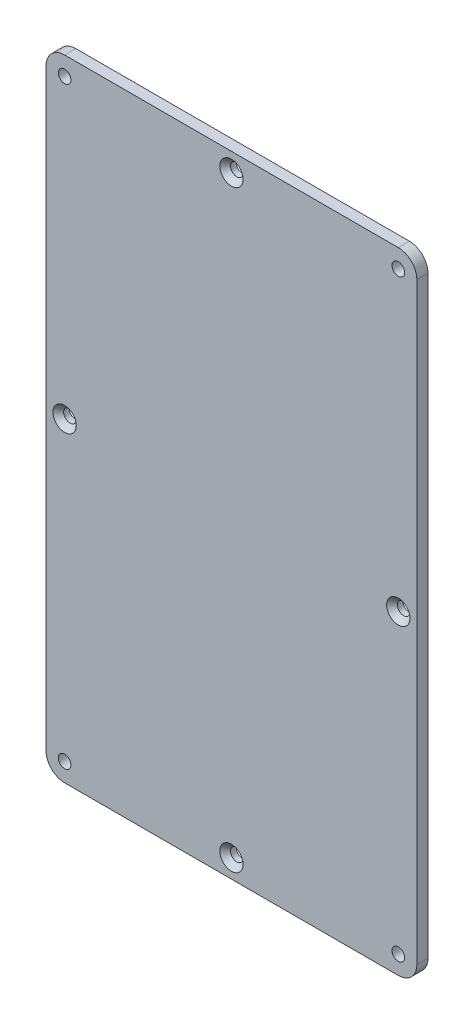
ISO-10303-21;
HEADER;
FILE_DESCRIPTION(('STEP AP214'),'2;1');
FILE_NAME('part.step','',(''),(''),'','','');
FILE_SCHEMA(('AUTOMOTIVE_DESIGN { 1 0 10303 214 1 1 1 1 }'));
ENDSEC;
DATA;
#1=APPLICATION_CONTEXT('core data for automotive mechanical design processes');
#2=APPLICATION_PROTOCOL_DEFINITION('international standard','automotive_design',2000,#1);
#3=PRODUCT_CONTEXT('',#1,'mechanical');
#4=PRODUCT('Part','Part','',(#3));
#5=PRODUCT_RELATED_PRODUCT_CATEGORY('part','',(#4));
#6=PRODUCT_DEFINITION_FORMATION('','',#4);
#7=PRODUCT_DEFINITION_CONTEXT('part definition',#1,'design');
#8=PRODUCT_DEFINITION('design','',#6,#7);
#9=PRODUCT_DEFINITION_SHAPE('','',#8);
#10=(LENGTH_UNIT() NAMED_UNIT(*) SI_UNIT(.MILLI.,.METRE.));
#11=(NAMED_UNIT(*) PLANE_ANGLE_UNIT() SI_UNIT($,.RADIAN.));
#12=(NAMED_UNIT(*) SI_UNIT($,.STERADIAN.) SOLID_ANGLE_UNIT());
#13=UNCERTAINTY_MEASURE_WITH_UNIT(LENGTH_MEASURE(1.E-05),#10,'distance_accuracy_value','');
#14=(GEOMETRIC_REPRESENTATION_CONTEXT(3) GLOBAL_UNCERTAINTY_ASSIGNED_CONTEXT((#13)) GLOBAL_UNIT_ASSIGNED_CONTEXT((#10,
#11,#12)) REPRESENTATION_CONTEXT('',''));
#15=CARTESIAN_POINT('',(0.,0.,0.));
#16=DIRECTION('',(0.,0.,1.));
#17=DIRECTION('',(1.,0.,0.));
#18=AXIS2_PLACEMENT_3D('',#15,#16,#17);
#19=CARTESIAN_POINT('',(0.,0.,3.));
#20=DIRECTION('',(0.,0.,-1.));
#21=DIRECTION('',(-1.,0.,0.));
#22=AXIS2_PLACEMENT_3D('',#19,#20,#21);
#23=PLANE('',#22);
#24=CARTESIAN_POINT('',(50.,165.,3.));
#25=DIRECTION('',(0.,0.,1.));
#26=DIRECTION('',(1.,0.,0.));
#27=AXIS2_PLACEMENT_3D('',#24,#25,#26);
#28=CIRCLE('',#27,3.15);
#29=CARTESIAN_POINT('',(53.15,165.,3.));
#30=VERTEX_POINT('',#29);
#31=EDGE_CURVE('E332',#30,#30,#28,.T.);
#32=ORIENTED_EDGE('',*,*,#31,.F.);
#33=EDGE_LOOP('',(#32));
#34=FACE_BOUND('',#33,.T.);
#35=CARTESIAN_POINT('',(50.,5.,3.));
#36=DIRECTION('',(0.,0.,1.));
#37=DIRECTION('',(1.,0.,0.));
#38=AXIS2_PLACEMENT_3D('',#35,#36,#37);
#39=CIRCLE('',#38,3.15);
#40=CARTESIAN_POINT('',(53.15,5.,3.));
#41=VERTEX_POINT('',#40);
#42=EDGE_CURVE('E180',#41,#41,#39,.T.);
#43=ORIENTED_EDGE('',*,*,#42,.F.);
#44=EDGE_LOOP('',(#43));
#45=FACE_BOUND('',#44,.T.);
#46=CARTESIAN_POINT('',(95.,85.,3.));
#47=DIRECTION('',(0.,0.,1.));
#48=DIRECTION('',(1.,0.,0.));
#49=AXIS2_PLACEMENT_3D('',#46,#47,#48);
#50=CIRCLE('',#49,3.15);
#51=CARTESIAN_POINT('',(98.15,85.,3.));
#52=VERTEX_POINT('',#51);
#53=EDGE_CURVE('E173',#52,#52,#50,.T.);
#54=ORIENTED_EDGE('',*,*,#53,.F.);
#55=EDGE_LOOP('',(#54));
#56=FACE_BOUND('',#55,.T.);
#57=CARTESIAN_POINT('',(4.99999999999997,165.,3.));
#58=DIRECTION('',(0.,0.,1.));
#59=DIRECTION('',(1.,0.,0.));
#60=AXIS2_PLACEMENT_3D('',#57,#58,#59);
#61=CIRCLE('',#60,1.7);
#62=CARTESIAN_POINT('',(6.69999999999997,165.,3.));
#63=VERTEX_POINT('',#62);
#64=EDGE_CURVE('E141',#63,#63,#61,.T.);
#65=ORIENTED_EDGE('',*,*,#64,.F.);
#66=EDGE_LOOP('',(#65));
#67=FACE_BOUND('',#66,.T.);
#68=CARTESIAN_POINT('',(95.,165.,3.));
#69=DIRECTION('',(0.,0.,1.));
#70=DIRECTION('',(1.,0.,0.));
#71=AXIS2_PLACEMENT_3D('',#68,#69,#70);
#72=CIRCLE('',#71,1.69999999999999);
#73=CARTESIAN_POINT('',(96.7,165.,3.));
#74=VERTEX_POINT('',#73);
#75=EDGE_CURVE('E140',#74,#74,#72,.T.);
#76=ORIENTED_EDGE('',*,*,#75,.F.);
#77=EDGE_LOOP('',(#76));
#78=FACE_BOUND('',#77,.T.);
#79=CARTESIAN_POINT('',(95.,5.,3.));
#80=DIRECTION('',(0.,0.,1.));
#81=DIRECTION('',(1.,0.,0.));
#82=AXIS2_PLACEMENT_3D('',#79,#80,#81);
#83=CIRCLE('',#82,1.69999999999999);
#84=CARTESIAN_POINT('',(96.7,5.,3.));
#85=VERTEX_POINT('',#84);
#86=EDGE_CURVE('E201',#85,#85,#83,.T.);
#87=ORIENTED_EDGE('',*,*,#86,.F.);
#88=EDGE_LOOP('',(#87));
#89=FACE_BOUND('',#88,.T.);
#90=CARTESIAN_POINT('',(4.99999999999999,5.,3.));
#91=DIRECTION('',(0.,0.,1.));
#92=DIRECTION('',(1.,0.,0.));
#93=AXIS2_PLACEMENT_3D('',#90,#91,#92);
#94=CIRCLE('',#93,1.7);
#95=CARTESIAN_POINT('',(6.69999999999999,5.,3.));
#96=VERTEX_POINT('',#95);
#97=EDGE_CURVE('E207',#96,#96,#94,.T.);
#98=ORIENTED_EDGE('',*,*,#97,.F.);
#99=EDGE_LOOP('',(#98));
#100=FACE_BOUND('',#99,.T.);
#101=DIRECTION('',(0.,1.,0.));
#102=VECTOR('',#101,1.);
#103=CARTESIAN_POINT('',(100.,0.,3.));
#104=LINE('',#103,#102);
#105=CARTESIAN_POINT('',(100.,5.,3.));
#106=VERTEX_POINT('',#105);
#107=CARTESIAN_POINT('',(100.,165.,3.));
#108=VERTEX_POINT('',#107);
#109=EDGE_CURVE('E215',#106,#108,#104,.T.);
#110=ORIENTED_EDGE('',*,*,#109,.T.);
#111=CARTESIAN_POINT('',(95.,165.,3.));
#112=DIRECTION('',(0.,0.,-1.));
#113=DIRECTION('',(-1.,0.,0.));
#114=AXIS2_PLACEMENT_3D('',#111,#112,#113);
#115=CIRCLE('',#114,5.);
#116=CARTESIAN_POINT('',(95.,170.,3.));
#117=VERTEX_POINT('',#116);
#118=EDGE_CURVE('E155',#108,#117,#115,.F.);
#119=ORIENTED_EDGE('',*,*,#118,.T.);
#120=DIRECTION('',(-1.,0.,0.));
#121=VECTOR('',#120,1.);
#122=CARTESIAN_POINT('',(0.,170.,3.));
#123=LINE('',#122,#121);
#124=CARTESIAN_POINT('',(4.99999999999997,170.,3.));
#125=VERTEX_POINT('',#124);
#126=EDGE_CURVE('E122',#117,#125,#123,.T.);
#127=ORIENTED_EDGE('',*,*,#126,.T.);
#128=CARTESIAN_POINT('',(4.99999999999997,165.,3.));
#129=DIRECTION('',(0.,0.,-1.));
#130=DIRECTION('',(-1.,0.,0.));
#131=AXIS2_PLACEMENT_3D('',#128,#129,#130);
#132=CIRCLE('',#131,5.);
#133=CARTESIAN_POINT('',(0.,165.,3.));
#134=VERTEX_POINT('',#133);
#135=EDGE_CURVE('E150',#125,#134,#132,.F.);
#136=ORIENTED_EDGE('',*,*,#135,.T.);
#137=DIRECTION('',(0.,-1.,0.));
#138=VECTOR('',#137,1.);
#139=CARTESIAN_POINT('',(0.,0.,3.));
#140=LINE('',#139,#138);
#141=CARTESIAN_POINT('',(0.,5.,3.));
#142=VERTEX_POINT('',#141);
#143=EDGE_CURVE('E128',#134,#142,#140,.T.);
#144=ORIENTED_EDGE('',*,*,#143,.T.);
#145=CARTESIAN_POINT('',(5.,5.,3.));
#146=DIRECTION('',(0.,0.,-1.));
#147=DIRECTION('',(-1.,0.,0.));
#148=AXIS2_PLACEMENT_3D('',#145,#146,#147);
#149=CIRCLE('',#148,5.);
#150=CARTESIAN_POINT('',(5.,0.,3.));
#151=VERTEX_POINT('',#150);
#152=EDGE_CURVE('E58',#142,#151,#149,.F.);
#153=ORIENTED_EDGE('',*,*,#152,.T.);
#154=DIRECTION('',(1.,0.,0.));
#155=VECTOR('',#154,1.);
#156=CARTESIAN_POINT('',(0.,0.,3.));
#157=LINE('',#156,#155);
#158=CARTESIAN_POINT('',(95.,0.,3.));
#159=VERTEX_POINT('',#158);
#160=EDGE_CURVE('E131',#151,#159,#157,.T.);
#161=ORIENTED_EDGE('',*,*,#160,.T.);
#162=CARTESIAN_POINT('',(95.,5.,3.));
#163=DIRECTION('',(0.,0.,-1.));
#164=DIRECTION('',(-1.,0.,0.));
#165=AXIS2_PLACEMENT_3D('',#162,#163,#164);
#166=CIRCLE('',#165,5.);
#167=EDGE_CURVE('E153',#159,#106,#166,.F.);
#168=ORIENTED_EDGE('',*,*,#167,.T.);
#169=EDGE_LOOP('',(#110,#119,#127,#136,#144,#153,#161,#168));
#170=FACE_BOUND('',#169,.T.);
#171=CARTESIAN_POINT('',(4.99999999999998,85.,3.));
#172=DIRECTION('',(0.,0.,1.));
#173=DIRECTION('',(1.,0.,0.));
#174=AXIS2_PLACEMENT_3D('',#171,#172,#173);
#175=CIRCLE('',#174,3.15);
#176=CARTESIAN_POINT('',(8.14999999999998,85.,3.));
#177=VERTEX_POINT('',#176);
#178=EDGE_CURVE('E169',#177,#177,#175,.T.);
#179=ORIENTED_EDGE('',*,*,#178,.F.);
#180=EDGE_LOOP('',(#179));
#181=FACE_BOUND('',#180,.T.);
#182=ADVANCED_FACE('F34',(#34,#45,#56,#67,#78,#89,#100,#170,#181),#23,.F.);
#183=CARTESIAN_POINT('',(0.,0.,3.));
#184=DIRECTION('',(1.,0.,0.));
#185=DIRECTION('',(0.,1.,0.));
#186=AXIS2_PLACEMENT_3D('',#183,#184,#185);
#187=PLANE('',#186);
#188=DIRECTION('',(0.,-1.,0.));
#189=VECTOR('',#188,1.);
#190=CARTESIAN_POINT('',(0.,0.,0.));
#191=LINE('',#190,#189);
#192=CARTESIAN_POINT('',(0.,165.,0.));
#193=VERTEX_POINT('',#192);
#194=CARTESIAN_POINT('',(0.,5.,0.));
#195=VERTEX_POINT('',#194);
#196=EDGE_CURVE('E212',#193,#195,#191,.T.);
#197=ORIENTED_EDGE('',*,*,#196,.T.);
#198=DIRECTION('',(0.,0.,-1.));
#199=VECTOR('',#198,1.);
#200=CARTESIAN_POINT('',(0.,5.,3.));
#201=LINE('',#200,#199);
#202=EDGE_CURVE('E11',#195,#142,#201,.F.);
#203=ORIENTED_EDGE('',*,*,#202,.T.);
#204=ORIENTED_EDGE('',*,*,#143,.F.);
#205=DIRECTION('',(0.,0.,-1.));
#206=VECTOR('',#205,1.);
#207=CARTESIAN_POINT('',(0.,165.,3.));
#208=LINE('',#207,#206);
#209=EDGE_CURVE('E43',#134,#193,#208,.T.);
#210=ORIENTED_EDGE('',*,*,#209,.T.);
#211=EDGE_LOOP('',(#197,#203,#204,#210));
#212=FACE_BOUND('',#211,.T.);
#213=ADVANCED_FACE('F238',(#212),#187,.F.);
#214=CARTESIAN_POINT('',(0.,0.,3.));
#215=DIRECTION('',(0.,1.,0.));
#216=DIRECTION('',(0.,0.,1.));
#217=AXIS2_PLACEMENT_3D('',#214,#215,#216);
#218=PLANE('',#217);
#219=DIRECTION('',(1.,0.,0.));
#220=VECTOR('',#219,1.);
#221=CARTESIAN_POINT('',(0.,0.,0.));
#222=LINE('',#221,#220);
#223=CARTESIAN_POINT('',(5.,0.,0.));
#224=VERTEX_POINT('',#223);
#225=CARTESIAN_POINT('',(95.,0.,0.));
#226=VERTEX_POINT('',#225);
#227=EDGE_CURVE('E133',#224,#226,#222,.T.);
#228=ORIENTED_EDGE('',*,*,#227,.T.);
#229=DIRECTION('',(0.,0.,-1.));
#230=VECTOR('',#229,1.);
#231=CARTESIAN_POINT('',(95.,0.,3.));
#232=LINE('',#231,#230);
#233=EDGE_CURVE('E51',#226,#159,#232,.F.);
#234=ORIENTED_EDGE('',*,*,#233,.T.);
#235=ORIENTED_EDGE('',*,*,#160,.F.);
#236=DIRECTION('',(0.,0.,-1.));
#237=VECTOR('',#236,1.);
#238=CARTESIAN_POINT('',(5.,0.,3.));
#239=LINE('',#238,#237);
#240=EDGE_CURVE('E157',#151,#224,#239,.T.);
#241=ORIENTED_EDGE('',*,*,#240,.T.);
#242=EDGE_LOOP('',(#228,#234,#235,#241));
#243=FACE_BOUND('',#242,.T.);
#244=ADVANCED_FACE('F221',(#243),#218,.F.);
#245=CARTESIAN_POINT('',(100.,0.,3.));
#246=DIRECTION('',(-1.,0.,0.));
#247=DIRECTION('',(0.,-1.,0.));
#248=AXIS2_PLACEMENT_3D('',#245,#246,#247);
#249=PLANE('',#248);
#250=DIRECTION('',(0.,1.,0.));
#251=VECTOR('',#250,1.);
#252=CARTESIAN_POINT('',(100.,0.,0.));
#253=LINE('',#252,#251);
#254=CARTESIAN_POINT('',(100.,5.,0.));
#255=VERTEX_POINT('',#254);
#256=CARTESIAN_POINT('',(100.,165.,0.));
#257=VERTEX_POINT('',#256);
#258=EDGE_CURVE('E129',#255,#257,#253,.T.);
#259=ORIENTED_EDGE('',*,*,#258,.T.);
#260=DIRECTION('',(0.,0.,-1.));
#261=VECTOR('',#260,1.);
#262=CARTESIAN_POINT('',(100.,165.,3.));
#263=LINE('',#262,#261);
#264=EDGE_CURVE('E107',#257,#108,#263,.F.);
#265=ORIENTED_EDGE('',*,*,#264,.T.);
#266=ORIENTED_EDGE('',*,*,#109,.F.);
#267=DIRECTION('',(0.,0.,-1.));
#268=VECTOR('',#267,1.);
#269=CARTESIAN_POINT('',(100.,5.,3.));
#270=LINE('',#269,#268);
#271=EDGE_CURVE('E112',#106,#255,#270,.T.);
#272=ORIENTED_EDGE('',*,*,#271,.T.);
#273=EDGE_LOOP('',(#259,#265,#266,#272));
#274=FACE_BOUND('',#273,.T.);
#275=ADVANCED_FACE('F230',(#274),#249,.F.);
#276=CARTESIAN_POINT('',(0.,170.,3.));
#277=DIRECTION('',(0.,-1.,0.));
#278=DIRECTION('',(0.,0.,-1.));
#279=AXIS2_PLACEMENT_3D('',#276,#277,#278);
#280=PLANE('',#279);
#281=ORIENTED_EDGE('',*,*,#126,.F.);
#282=DIRECTION('',(0.,0.,-1.));
#283=VECTOR('',#282,1.);
#284=CARTESIAN_POINT('',(95.,170.,3.));
#285=LINE('',#284,#283);
#286=CARTESIAN_POINT('',(95.,170.,0.));
#287=VERTEX_POINT('',#286);
#288=EDGE_CURVE('E106',#117,#287,#285,.T.);
#289=ORIENTED_EDGE('',*,*,#288,.T.);
#290=DIRECTION('',(-1.,0.,0.));
#291=VECTOR('',#290,1.);
#292=CARTESIAN_POINT('',(0.,170.,0.));
#293=LINE('',#292,#291);
#294=CARTESIAN_POINT('',(4.99999999999997,170.,0.));
#295=VERTEX_POINT('',#294);
#296=EDGE_CURVE('E119',#287,#295,#293,.T.);
#297=ORIENTED_EDGE('',*,*,#296,.T.);
#298=DIRECTION('',(0.,0.,-1.));
#299=VECTOR('',#298,1.);
#300=CARTESIAN_POINT('',(4.99999999999997,170.,3.));
#301=LINE('',#300,#299);
#302=EDGE_CURVE('E124',#295,#125,#301,.F.);
#303=ORIENTED_EDGE('',*,*,#302,.T.);
#304=EDGE_LOOP('',(#281,#289,#297,#303));
#305=FACE_BOUND('',#304,.T.);
#306=ADVANCED_FACE('F118',(#305),#280,.F.);
#307=CARTESIAN_POINT('',(0.,0.,0.));
#308=DIRECTION('',(0.,0.,-1.));
#309=DIRECTION('',(-1.,0.,0.));
#310=AXIS2_PLACEMENT_3D('',#307,#308,#309);
#311=PLANE('',#310);
#312=CARTESIAN_POINT('',(50.,165.,0.));
#313=DIRECTION('',(0.,0.,-1.));
#314=DIRECTION('',(-1.,0.,0.));
#315=AXIS2_PLACEMENT_3D('',#312,#313,#314);
#316=CIRCLE('',#315,1.69999999999999);
#317=CARTESIAN_POINT('',(48.3,165.,0.));
#318=VERTEX_POINT('',#317);
#319=EDGE_CURVE('E38',#318,#318,#316,.T.);
#320=ORIENTED_EDGE('',*,*,#319,.F.);
#321=EDGE_LOOP('',(#320));
#322=FACE_BOUND('',#321,.T.);
#323=CARTESIAN_POINT('',(50.,5.,0.));
#324=DIRECTION('',(0.,0.,-1.));
#325=DIRECTION('',(-1.,0.,0.));
#326=AXIS2_PLACEMENT_3D('',#323,#324,#325);
#327=CIRCLE('',#326,1.69999999999999);
#328=CARTESIAN_POINT('',(48.3,5.,0.));
#329=VERTEX_POINT('',#328);
#330=EDGE_CURVE('E171',#329,#329,#327,.T.);
#331=ORIENTED_EDGE('',*,*,#330,.F.);
#332=EDGE_LOOP('',(#331));
#333=FACE_BOUND('',#332,.T.);
#334=CARTESIAN_POINT('',(95.,85.,0.));
#335=DIRECTION('',(0.,0.,-1.));
#336=DIRECTION('',(-1.,0.,0.));
#337=AXIS2_PLACEMENT_3D('',#334,#335,#336);
#338=CIRCLE('',#337,1.69999999999999);
#339=CARTESIAN_POINT('',(93.3,85.,0.));
#340=VERTEX_POINT('',#339);
#341=EDGE_CURVE('E167',#340,#340,#338,.T.);
#342=ORIENTED_EDGE('',*,*,#341,.F.);
#343=EDGE_LOOP('',(#342));
#344=FACE_BOUND('',#343,.T.);
#345=CARTESIAN_POINT('',(4.99999999999998,85.,0.));
#346=DIRECTION('',(0.,0.,-1.));
#347=DIRECTION('',(-1.,0.,0.));
#348=AXIS2_PLACEMENT_3D('',#345,#346,#347);
#349=CIRCLE('',#348,1.69999999999999);
#350=CARTESIAN_POINT('',(3.29999999999999,85.,0.));
#351=VERTEX_POINT('',#350);
#352=EDGE_CURVE('E163',#351,#351,#349,.T.);
#353=ORIENTED_EDGE('',*,*,#352,.F.);
#354=EDGE_LOOP('',(#353));
#355=FACE_BOUND('',#354,.T.);
#356=CARTESIAN_POINT('',(4.99999999999997,165.,0.));
#357=DIRECTION('',(0.,0.,-1.));
#358=DIRECTION('',(-1.,0.,0.));
#359=AXIS2_PLACEMENT_3D('',#356,#357,#358);
#360=CIRCLE('',#359,1.7);
#361=CARTESIAN_POINT('',(3.29999999999997,165.,0.));
#362=VERTEX_POINT('',#361);
#363=EDGE_CURVE('E137',#362,#362,#360,.T.);
#364=ORIENTED_EDGE('',*,*,#363,.F.);
#365=EDGE_LOOP('',(#364));
#366=FACE_BOUND('',#365,.T.);
#367=CARTESIAN_POINT('',(95.,165.,0.));
#368=DIRECTION('',(0.,0.,-1.));
#369=DIRECTION('',(-1.,0.,0.));
#370=AXIS2_PLACEMENT_3D('',#367,#368,#369);
#371=CIRCLE('',#370,1.69999999999999);
#372=CARTESIAN_POINT('',(93.3,165.,0.));
#373=VERTEX_POINT('',#372);
#374=EDGE_CURVE('E198',#373,#373,#371,.T.);
#375=ORIENTED_EDGE('',*,*,#374,.F.);
#376=EDGE_LOOP('',(#375));
#377=FACE_BOUND('',#376,.T.);
#378=CARTESIAN_POINT('',(95.,5.,0.));
#379=DIRECTION('',(0.,0.,-1.));
#380=DIRECTION('',(-1.,0.,0.));
#381=AXIS2_PLACEMENT_3D('',#378,#379,#380);
#382=CIRCLE('',#381,1.69999999999999);
#383=CARTESIAN_POINT('',(93.3,5.,0.));
#384=VERTEX_POINT('',#383);
#385=EDGE_CURVE('E204',#384,#384,#382,.T.);
#386=ORIENTED_EDGE('',*,*,#385,.F.);
#387=EDGE_LOOP('',(#386));
#388=FACE_BOUND('',#387,.T.);
#389=CARTESIAN_POINT('',(4.99999999999999,5.,0.));
#390=DIRECTION('',(0.,0.,-1.));
#391=DIRECTION('',(-1.,0.,0.));
#392=AXIS2_PLACEMENT_3D('',#389,#390,#391);
#393=CIRCLE('',#392,1.7);
#394=CARTESIAN_POINT('',(3.29999999999999,5.,0.));
#395=VERTEX_POINT('',#394);
#396=EDGE_CURVE('E210',#395,#395,#393,.T.);
#397=ORIENTED_EDGE('',*,*,#396,.F.);
#398=EDGE_LOOP('',(#397));
#399=FACE_BOUND('',#398,.T.);
#400=ORIENTED_EDGE('',*,*,#296,.F.);
#401=CARTESIAN_POINT('',(95.,165.,0.));
#402=DIRECTION('',(0.,0.,-1.));
#403=DIRECTION('',(-1.,0.,0.));
#404=AXIS2_PLACEMENT_3D('',#401,#402,#403);
#405=CIRCLE('',#404,5.);
#406=EDGE_CURVE('E102',#287,#257,#405,.T.);
#407=ORIENTED_EDGE('',*,*,#406,.T.);
#408=ORIENTED_EDGE('',*,*,#258,.F.);
#409=CARTESIAN_POINT('',(95.,5.,0.));
#410=DIRECTION('',(0.,0.,-1.));
#411=DIRECTION('',(-1.,0.,0.));
#412=AXIS2_PLACEMENT_3D('',#409,#410,#411);
#413=CIRCLE('',#412,5.);
#414=EDGE_CURVE('E113',#255,#226,#413,.T.);
#415=ORIENTED_EDGE('',*,*,#414,.T.);
#416=ORIENTED_EDGE('',*,*,#227,.F.);
#417=CARTESIAN_POINT('',(5.,5.,0.));
#418=DIRECTION('',(0.,0.,-1.));
#419=DIRECTION('',(-1.,0.,0.));
#420=AXIS2_PLACEMENT_3D('',#417,#418,#419);
#421=CIRCLE('',#420,5.);
#422=EDGE_CURVE('E144',#224,#195,#421,.T.);
#423=ORIENTED_EDGE('',*,*,#422,.T.);
#424=ORIENTED_EDGE('',*,*,#196,.F.);
#425=CARTESIAN_POINT('',(4.99999999999997,165.,0.));
#426=DIRECTION('',(0.,0.,-1.));
#427=DIRECTION('',(-1.,0.,0.));
#428=AXIS2_PLACEMENT_3D('',#425,#426,#427);
#429=CIRCLE('',#428,5.);
#430=EDGE_CURVE('E123',#193,#295,#429,.T.);
#431=ORIENTED_EDGE('',*,*,#430,.T.);
#432=EDGE_LOOP('',(#400,#407,#408,#415,#416,#423,#424,#431));
#433=FACE_BOUND('',#432,.T.);
#434=ADVANCED_FACE('F126',(#322,#333,#344,#355,#366,#377,#388,#399,#433),#311,.T.);
#435=CARTESIAN_POINT('',(4.99999999999999,5.,3.));
#436=DIRECTION('',(0.,0.,1.));
#437=DIRECTION('',(1.,0.,0.));
#438=AXIS2_PLACEMENT_3D('',#435,#436,#437);
#439=CYLINDRICAL_SURFACE('',#438,1.7);
#440=ORIENTED_EDGE('',*,*,#396,.T.);
#441=EDGE_LOOP('',(#440));
#442=FACE_BOUND('',#441,.T.);
#443=ORIENTED_EDGE('',*,*,#97,.T.);
#444=EDGE_LOOP('',(#443));
#445=FACE_BOUND('',#444,.T.);
#446=ADVANCED_FACE('F252',(#442,#445),#439,.F.);
#447=CARTESIAN_POINT('',(95.,5.,3.));
#448=DIRECTION('',(0.,0.,1.));
#449=DIRECTION('',(1.,0.,0.));
#450=AXIS2_PLACEMENT_3D('',#447,#448,#449);
#451=CYLINDRICAL_SURFACE('',#450,1.69999999999999);
#452=ORIENTED_EDGE('',*,*,#385,.T.);
#453=EDGE_LOOP('',(#452));
#454=FACE_BOUND('',#453,.T.);
#455=ORIENTED_EDGE('',*,*,#86,.T.);
#456=EDGE_LOOP('',(#455));
#457=FACE_BOUND('',#456,.T.);
#458=ADVANCED_FACE('F259',(#454,#457),#451,.F.);
#459=CARTESIAN_POINT('',(95.,165.,3.));
#460=DIRECTION('',(0.,0.,1.));
#461=DIRECTION('',(1.,0.,0.));
#462=AXIS2_PLACEMENT_3D('',#459,#460,#461);
#463=CYLINDRICAL_SURFACE('',#462,1.69999999999999);
#464=ORIENTED_EDGE('',*,*,#374,.T.);
#465=EDGE_LOOP('',(#464));
#466=FACE_BOUND('',#465,.T.);
#467=ORIENTED_EDGE('',*,*,#75,.T.);
#468=EDGE_LOOP('',(#467));
#469=FACE_BOUND('',#468,.T.);
#470=ADVANCED_FACE('F282',(#466,#469),#463,.F.);
#471=CARTESIAN_POINT('',(4.99999999999997,165.,3.));
#472=DIRECTION('',(0.,0.,1.));
#473=DIRECTION('',(1.,0.,0.));
#474=AXIS2_PLACEMENT_3D('',#471,#472,#473);
#475=CYLINDRICAL_SURFACE('',#474,1.7);
#476=ORIENTED_EDGE('',*,*,#363,.T.);
#477=EDGE_LOOP('',(#476));
#478=FACE_BOUND('',#477,.T.);
#479=ORIENTED_EDGE('',*,*,#64,.T.);
#480=EDGE_LOOP('',(#479));
#481=FACE_BOUND('',#480,.T.);
#482=ADVANCED_FACE('F288',(#478,#481),#475,.F.);
#483=CARTESIAN_POINT('',(95.,165.,3.));
#484=DIRECTION('',(0.,0.,-1.));
#485=DIRECTION('',(-1.,0.,0.));
#486=AXIS2_PLACEMENT_3D('',#483,#484,#485);
#487=CYLINDRICAL_SURFACE('',#486,5.);
#488=ORIENTED_EDGE('',*,*,#118,.F.);
#489=ORIENTED_EDGE('',*,*,#264,.F.);
#490=ORIENTED_EDGE('',*,*,#406,.F.);
#491=ORIENTED_EDGE('',*,*,#288,.F.);
#492=EDGE_LOOP('',(#488,#489,#490,#491));
#493=FACE_BOUND('',#492,.T.);
#494=ADVANCED_FACE('F105',(#493),#487,.T.);
#495=CARTESIAN_POINT('',(95.,5.,3.));
#496=DIRECTION('',(0.,0.,-1.));
#497=DIRECTION('',(-1.,0.,0.));
#498=AXIS2_PLACEMENT_3D('',#495,#496,#497);
#499=CYLINDRICAL_SURFACE('',#498,5.);
#500=ORIENTED_EDGE('',*,*,#167,.F.);
#501=ORIENTED_EDGE('',*,*,#233,.F.);
#502=ORIENTED_EDGE('',*,*,#414,.F.);
#503=ORIENTED_EDGE('',*,*,#271,.F.);
#504=EDGE_LOOP('',(#500,#501,#502,#503));
#505=FACE_BOUND('',#504,.T.);
#506=ADVANCED_FACE('F225',(#505),#499,.T.);
#507=CARTESIAN_POINT('',(5.,5.,3.));
#508=DIRECTION('',(0.,0.,-1.));
#509=DIRECTION('',(-1.,0.,0.));
#510=AXIS2_PLACEMENT_3D('',#507,#508,#509);
#511=CYLINDRICAL_SURFACE('',#510,5.);
#512=ORIENTED_EDGE('',*,*,#152,.F.);
#513=ORIENTED_EDGE('',*,*,#202,.F.);
#514=ORIENTED_EDGE('',*,*,#422,.F.);
#515=ORIENTED_EDGE('',*,*,#240,.F.);
#516=EDGE_LOOP('',(#512,#513,#514,#515));
#517=FACE_BOUND('',#516,.T.);
#518=ADVANCED_FACE('F369',(#517),#511,.T.);
#519=CARTESIAN_POINT('',(4.99999999999997,165.,3.));
#520=DIRECTION('',(0.,0.,-1.));
#521=DIRECTION('',(-1.,0.,0.));
#522=AXIS2_PLACEMENT_3D('',#519,#520,#521);
#523=CYLINDRICAL_SURFACE('',#522,5.);
#524=ORIENTED_EDGE('',*,*,#135,.F.);
#525=ORIENTED_EDGE('',*,*,#302,.F.);
#526=ORIENTED_EDGE('',*,*,#430,.F.);
#527=ORIENTED_EDGE('',*,*,#209,.F.);
#528=EDGE_LOOP('',(#524,#525,#526,#527));
#529=FACE_BOUND('',#528,.T.);
#530=ADVANCED_FACE('F36',(#529),#523,.T.);
#531=CARTESIAN_POINT('',(4.99999999999998,85.,3.));
#532=DIRECTION('',(0.,0.,1.));
#533=DIRECTION('',(1.,0.,0.));
#534=AXIS2_PLACEMENT_3D('',#531,#532,#533);
#535=CYLINDRICAL_SURFACE('',#534,1.69999999999999);
#536=ORIENTED_EDGE('',*,*,#352,.T.);
#537=EDGE_LOOP('',(#536));
#538=FACE_BOUND('',#537,.T.);
#539=CARTESIAN_POINT('',(4.99999999999998,85.,1.54999999999999));
#540=DIRECTION('',(0.,0.,1.));
#541=DIRECTION('',(1.,0.,0.));
#542=AXIS2_PLACEMENT_3D('',#539,#540,#541);
#543=CIRCLE('',#542,1.69999999999999);
#544=CARTESIAN_POINT('',(6.69999999999997,85.,1.54999999999999));
#545=VERTEX_POINT('',#544);
#546=EDGE_CURVE('E166',#545,#545,#543,.T.);
#547=ORIENTED_EDGE('',*,*,#546,.T.);
#548=EDGE_LOOP('',(#547));
#549=FACE_BOUND('',#548,.T.);
#550=ADVANCED_FACE('F295',(#538,#549),#535,.F.);
#551=CARTESIAN_POINT('',(4.99999999999998,85.,3.));
#552=DIRECTION('',(0.,0.,1.));
#553=DIRECTION('',(1.,0.,0.));
#554=AXIS2_PLACEMENT_3D('',#551,#552,#553);
#555=CONICAL_SURFACE('',#554,3.15,0.78539816339745);
#556=ORIENTED_EDGE('',*,*,#546,.F.);
#557=EDGE_LOOP('',(#556));
#558=FACE_BOUND('',#557,.T.);
#559=ORIENTED_EDGE('',*,*,#178,.T.);
#560=EDGE_LOOP('',(#559));
#561=FACE_BOUND('',#560,.T.);
#562=ADVANCED_FACE('F298',(#558,#561),#555,.F.);
#563=CARTESIAN_POINT('',(95.,85.,3.));
#564=DIRECTION('',(0.,0.,1.));
#565=DIRECTION('',(1.,0.,0.));
#566=AXIS2_PLACEMENT_3D('',#563,#564,#565);
#567=CYLINDRICAL_SURFACE('',#566,1.69999999999999);
#568=ORIENTED_EDGE('',*,*,#341,.T.);
#569=EDGE_LOOP('',(#568));
#570=FACE_BOUND('',#569,.T.);
#571=CARTESIAN_POINT('',(95.,85.,1.54999999999999));
#572=DIRECTION('',(0.,0.,1.));
#573=DIRECTION('',(1.,0.,0.));
#574=AXIS2_PLACEMENT_3D('',#571,#572,#573);
#575=CIRCLE('',#574,1.69999999999999);
#576=CARTESIAN_POINT('',(96.7,85.,1.54999999999999));
#577=VERTEX_POINT('',#576);
#578=EDGE_CURVE('E170',#577,#577,#575,.T.);
#579=ORIENTED_EDGE('',*,*,#578,.T.);
#580=EDGE_LOOP('',(#579));
#581=FACE_BOUND('',#580,.T.);
#582=ADVANCED_FACE('F302',(#570,#581),#567,.F.);
#583=CARTESIAN_POINT('',(95.,85.,3.));
#584=DIRECTION('',(0.,0.,1.));
#585=DIRECTION('',(1.,0.,0.));
#586=AXIS2_PLACEMENT_3D('',#583,#584,#585);
#587=CONICAL_SURFACE('',#586,3.15,0.785398163397448);
#588=ORIENTED_EDGE('',*,*,#578,.F.);
#589=EDGE_LOOP('',(#588));
#590=FACE_BOUND('',#589,.T.);
#591=ORIENTED_EDGE('',*,*,#53,.T.);
#592=EDGE_LOOP('',(#591));
#593=FACE_BOUND('',#592,.T.);
#594=ADVANCED_FACE('F306',(#590,#593),#587,.F.);
#595=CARTESIAN_POINT('',(50.,5.,3.));
#596=DIRECTION('',(0.,0.,1.));
#597=DIRECTION('',(1.,0.,0.));
#598=AXIS2_PLACEMENT_3D('',#595,#596,#597);
#599=CYLINDRICAL_SURFACE('',#598,1.69999999999999);
#600=ORIENTED_EDGE('',*,*,#330,.T.);
#601=EDGE_LOOP('',(#600));
#602=FACE_BOUND('',#601,.T.);
#603=CARTESIAN_POINT('',(50.,5.,1.54999999999999));
#604=DIRECTION('',(0.,0.,1.));
#605=DIRECTION('',(1.,0.,0.));
#606=AXIS2_PLACEMENT_3D('',#603,#604,#605);
#607=CIRCLE('',#606,1.69999999999999);
#608=CARTESIAN_POINT('',(51.6999999999999,5.,1.54999999999999));
#609=VERTEX_POINT('',#608);
#610=EDGE_CURVE('E174',#609,#609,#607,.T.);
#611=ORIENTED_EDGE('',*,*,#610,.T.);
#612=EDGE_LOOP('',(#611));
#613=FACE_BOUND('',#612,.T.);
#614=ADVANCED_FACE('F310',(#602,#613),#599,.F.);
#615=CARTESIAN_POINT('',(50.,5.,3.));
#616=DIRECTION('',(0.,0.,1.));
#617=DIRECTION('',(1.,0.,0.));
#618=AXIS2_PLACEMENT_3D('',#615,#616,#617);
#619=CONICAL_SURFACE('',#618,3.15,0.78539816339745);
#620=ORIENTED_EDGE('',*,*,#610,.F.);
#621=EDGE_LOOP('',(#620));
#622=FACE_BOUND('',#621,.T.);
#623=ORIENTED_EDGE('',*,*,#42,.T.);
#624=EDGE_LOOP('',(#623));
#625=FACE_BOUND('',#624,.T.);
#626=ADVANCED_FACE('F314',(#622,#625),#619,.F.);
#627=CARTESIAN_POINT('',(50.,165.,3.));
#628=DIRECTION('',(0.,0.,1.));
#629=DIRECTION('',(1.,0.,0.));
#630=AXIS2_PLACEMENT_3D('',#627,#628,#629);
#631=CYLINDRICAL_SURFACE('',#630,1.69999999999999);
#632=ORIENTED_EDGE('',*,*,#319,.T.);
#633=EDGE_LOOP('',(#632));
#634=FACE_BOUND('',#633,.T.);
#635=CARTESIAN_POINT('',(50.,165.,1.54999999999999));
#636=DIRECTION('',(0.,0.,1.));
#637=DIRECTION('',(1.,0.,0.));
#638=AXIS2_PLACEMENT_3D('',#635,#636,#637);
#639=CIRCLE('',#638,1.69999999999999);
#640=CARTESIAN_POINT('',(51.6999999999999,165.,1.54999999999999));
#641=VERTEX_POINT('',#640);
#642=EDGE_CURVE('E330',#641,#641,#639,.T.);
#643=ORIENTED_EDGE('',*,*,#642,.T.);
#644=EDGE_LOOP('',(#643));
#645=FACE_BOUND('',#644,.T.);
#646=ADVANCED_FACE('F317',(#634,#645),#631,.F.);
#647=CARTESIAN_POINT('',(50.,165.,3.));
#648=DIRECTION('',(0.,0.,1.));
#649=DIRECTION('',(1.,0.,0.));
#650=AXIS2_PLACEMENT_3D('',#647,#648,#649);
#651=CONICAL_SURFACE('',#650,3.15,0.78539816339745);
#652=ORIENTED_EDGE('',*,*,#642,.F.);
#653=EDGE_LOOP('',(#652));
#654=FACE_BOUND('',#653,.T.);
#655=ORIENTED_EDGE('',*,*,#31,.T.);
#656=EDGE_LOOP('',(#655));
#657=FACE_BOUND('',#656,.T.);
#658=ADVANCED_FACE('F321',(#654,#657),#651,.F.);
#659=CLOSED_SHELL('',(#182,#213,#244,#275,#306,#434,#446,#458,#470,#482,#494,#506,#518,#530,
#550,#562,#582,#594,#614,#626,#646,#658));
#660=MANIFOLD_SOLID_BREP('B2',#659);
#661=ADVANCED_BREP_SHAPE_REPRESENTATION('',(#18,#660),#14);
#662=SHAPE_DEFINITION_REPRESENTATION(#9,#661);
ENDSEC;
END-ISO-10303-21;
